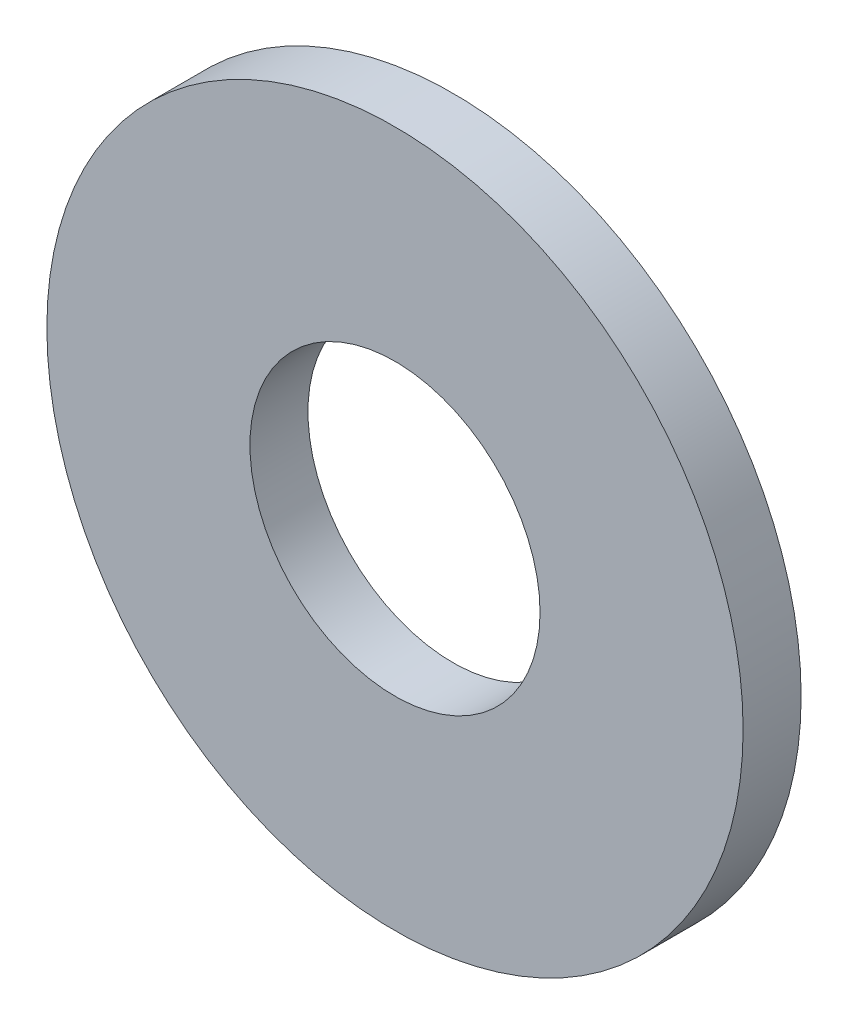
ISO-10303-21;
HEADER;
FILE_DESCRIPTION(('STEP AP214'),'2;1');
FILE_NAME('part.step','',(''),(''),'','','');
FILE_SCHEMA(('AUTOMOTIVE_DESIGN { 1 0 10303 214 1 1 1 1 }'));
ENDSEC;
DATA;
#1=APPLICATION_CONTEXT('core data for automotive mechanical design processes');
#2=APPLICATION_PROTOCOL_DEFINITION('international standard','automotive_design',2000,#1);
#3=PRODUCT_CONTEXT('',#1,'mechanical');
#4=PRODUCT('Part','Part','',(#3));
#5=PRODUCT_RELATED_PRODUCT_CATEGORY('part','',(#4));
#6=PRODUCT_DEFINITION_FORMATION('','',#4);
#7=PRODUCT_DEFINITION_CONTEXT('part definition',#1,'design');
#8=PRODUCT_DEFINITION('design','',#6,#7);
#9=PRODUCT_DEFINITION_SHAPE('','',#8);
#10=(LENGTH_UNIT() NAMED_UNIT(*) SI_UNIT(.MILLI.,.METRE.));
#11=(NAMED_UNIT(*) PLANE_ANGLE_UNIT() SI_UNIT($,.RADIAN.));
#12=(NAMED_UNIT(*) SI_UNIT($,.STERADIAN.) SOLID_ANGLE_UNIT());
#13=UNCERTAINTY_MEASURE_WITH_UNIT(LENGTH_MEASURE(1.E-05),#10,'distance_accuracy_value','');
#14=(GEOMETRIC_REPRESENTATION_CONTEXT(3) GLOBAL_UNCERTAINTY_ASSIGNED_CONTEXT((#13)) GLOBAL_UNIT_ASSIGNED_CONTEXT((#10,
#11,#12)) REPRESENTATION_CONTEXT('',''));
#15=CARTESIAN_POINT('',(0.,0.,0.));
#16=DIRECTION('',(0.,0.,1.));
#17=DIRECTION('',(1.,0.,0.));
#18=AXIS2_PLACEMENT_3D('',#15,#16,#17);
#19=CARTESIAN_POINT('',(0.,0.,2.));
#20=DIRECTION('',(0.,0.,1.));
#21=DIRECTION('',(1.,0.,0.));
#22=AXIS2_PLACEMENT_3D('',#19,#20,#21);
#23=PLANE('',#22);
#24=CARTESIAN_POINT('',(0.,0.,2.));
#25=DIRECTION('',(0.,0.,1.));
#26=DIRECTION('',(1.,0.,0.));
#27=AXIS2_PLACEMENT_3D('',#24,#25,#26);
#28=CIRCLE('',#27,12.);
#29=CARTESIAN_POINT('',(12.,0.,2.));
#30=VERTEX_POINT('',#29);
#31=EDGE_CURVE('E10',#30,#30,#28,.T.);
#32=ORIENTED_EDGE('',*,*,#31,.T.);
#33=EDGE_LOOP('',(#32));
#34=FACE_BOUND('',#33,.T.);
#35=CARTESIAN_POINT('',(0.,0.,2.));
#36=DIRECTION('',(0.,0.,1.));
#37=DIRECTION('',(1.,0.,0.));
#38=AXIS2_PLACEMENT_3D('',#35,#36,#37);
#39=CIRCLE('',#38,5.);
#40=CARTESIAN_POINT('',(5.,0.,2.));
#41=VERTEX_POINT('',#40);
#42=EDGE_CURVE('E40',#41,#41,#39,.T.);
#43=ORIENTED_EDGE('',*,*,#42,.F.);
#44=EDGE_LOOP('',(#43));
#45=FACE_BOUND('',#44,.T.);
#46=ADVANCED_FACE('F29',(#34,#45),#23,.T.);
#47=CARTESIAN_POINT('',(0.,0.,0.));
#48=DIRECTION('',(0.,0.,1.));
#49=DIRECTION('',(1.,0.,0.));
#50=AXIS2_PLACEMENT_3D('',#47,#48,#49);
#51=PLANE('',#50);
#52=CARTESIAN_POINT('',(0.,0.,0.));
#53=DIRECTION('',(0.,0.,1.));
#54=DIRECTION('',(1.,0.,0.));
#55=AXIS2_PLACEMENT_3D('',#52,#53,#54);
#56=CIRCLE('',#55,12.);
#57=CARTESIAN_POINT('',(12.,0.,0.));
#58=VERTEX_POINT('',#57);
#59=EDGE_CURVE('E33',#58,#58,#56,.T.);
#60=ORIENTED_EDGE('',*,*,#59,.F.);
#61=EDGE_LOOP('',(#60));
#62=FACE_BOUND('',#61,.T.);
#63=CARTESIAN_POINT('',(0.,0.,0.));
#64=DIRECTION('',(0.,0.,1.));
#65=DIRECTION('',(1.,0.,0.));
#66=AXIS2_PLACEMENT_3D('',#63,#64,#65);
#67=CIRCLE('',#66,5.);
#68=CARTESIAN_POINT('',(5.,0.,0.));
#69=VERTEX_POINT('',#68);
#70=EDGE_CURVE('E42',#69,#69,#67,.T.);
#71=ORIENTED_EDGE('',*,*,#70,.T.);
#72=EDGE_LOOP('',(#71));
#73=FACE_BOUND('',#72,.T.);
#74=ADVANCED_FACE('F52',(#62,#73),#51,.F.);
#75=CARTESIAN_POINT('',(0.,0.,2.));
#76=DIRECTION('',(0.,0.,-1.));
#77=DIRECTION('',(-1.,0.,0.));
#78=AXIS2_PLACEMENT_3D('',#75,#76,#77);
#79=CYLINDRICAL_SURFACE('',#78,12.);
#80=ORIENTED_EDGE('',*,*,#31,.F.);
#81=EDGE_LOOP('',(#80));
#82=FACE_BOUND('',#81,.T.);
#83=ORIENTED_EDGE('',*,*,#59,.T.);
#84=EDGE_LOOP('',(#83));
#85=FACE_BOUND('',#84,.T.);
#86=ADVANCED_FACE('F31',(#82,#85),#79,.T.);
#87=CARTESIAN_POINT('',(0.,0.,2.));
#88=DIRECTION('',(0.,0.,-1.));
#89=DIRECTION('',(-1.,0.,0.));
#90=AXIS2_PLACEMENT_3D('',#87,#88,#89);
#91=CYLINDRICAL_SURFACE('',#90,5.);
#92=ORIENTED_EDGE('',*,*,#42,.T.);
#93=EDGE_LOOP('',(#92));
#94=FACE_BOUND('',#93,.T.);
#95=ORIENTED_EDGE('',*,*,#70,.F.);
#96=EDGE_LOOP('',(#95));
#97=FACE_BOUND('',#96,.T.);
#98=ADVANCED_FACE('F48',(#94,#97),#91,.F.);
#99=CLOSED_SHELL('',(#46,#74,#86,#98));
#100=MANIFOLD_SOLID_BREP('B2',#99);
#101=ADVANCED_BREP_SHAPE_REPRESENTATION('',(#18,#100),#14);
#102=SHAPE_DEFINITION_REPRESENTATION(#9,#101);
ENDSEC;
END-ISO-10303-21;
